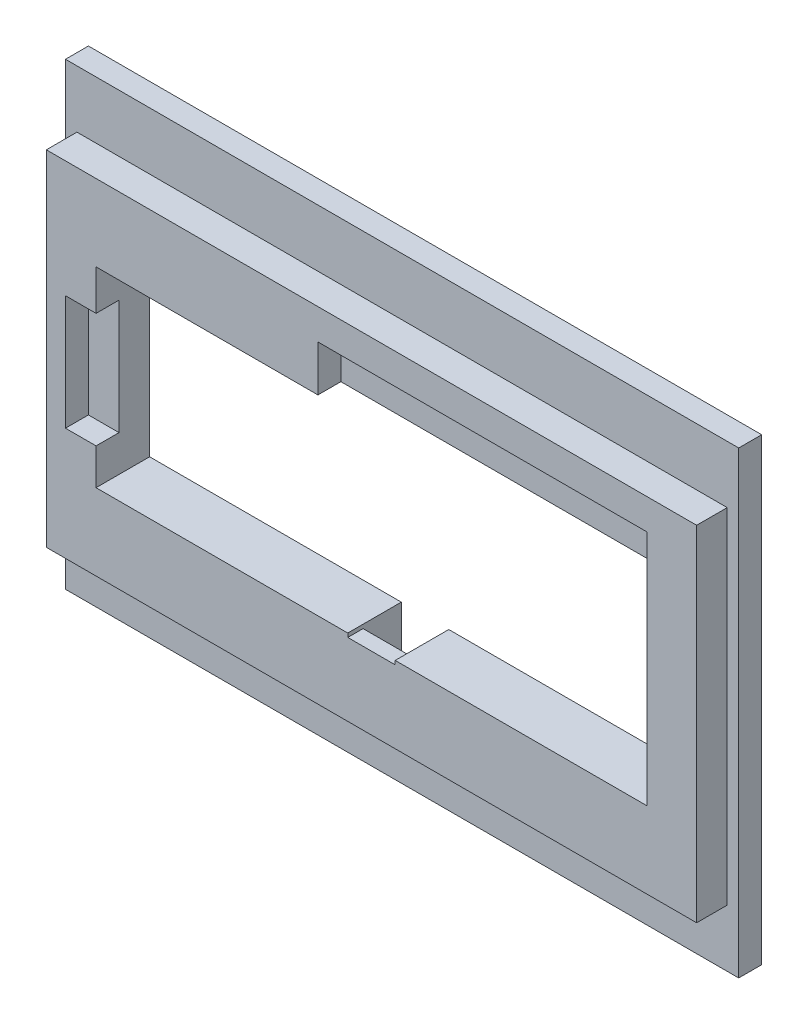
ISO-10303-21;
HEADER;
FILE_DESCRIPTION(('STEP AP214'),'2;1');
FILE_NAME('part.step','',(''),(''),'','','');
FILE_SCHEMA(('AUTOMOTIVE_DESIGN { 1 0 10303 214 1 1 1 1 }'));
ENDSEC;
DATA;
#1=APPLICATION_CONTEXT('core data for automotive mechanical design processes');
#2=APPLICATION_PROTOCOL_DEFINITION('international standard','automotive_design',2000,#1);
#3=PRODUCT_CONTEXT('',#1,'mechanical');
#4=PRODUCT('Part','Part','',(#3));
#5=PRODUCT_RELATED_PRODUCT_CATEGORY('part','',(#4));
#6=PRODUCT_DEFINITION_FORMATION('','',#4);
#7=PRODUCT_DEFINITION_CONTEXT('part definition',#1,'design');
#8=PRODUCT_DEFINITION('design','',#6,#7);
#9=PRODUCT_DEFINITION_SHAPE('','',#8);
#10=(LENGTH_UNIT() NAMED_UNIT(*) SI_UNIT(.MILLI.,.METRE.));
#11=(NAMED_UNIT(*) PLANE_ANGLE_UNIT() SI_UNIT($,.RADIAN.));
#12=(NAMED_UNIT(*) SI_UNIT($,.STERADIAN.) SOLID_ANGLE_UNIT());
#13=UNCERTAINTY_MEASURE_WITH_UNIT(LENGTH_MEASURE(1.E-05),#10,'distance_accuracy_value','');
#14=(GEOMETRIC_REPRESENTATION_CONTEXT(3) GLOBAL_UNCERTAINTY_ASSIGNED_CONTEXT((#13)) GLOBAL_UNIT_ASSIGNED_CONTEXT((#10,
#11,#12)) REPRESENTATION_CONTEXT('',''));
#15=CARTESIAN_POINT('',(0.,0.,0.));
#16=DIRECTION('',(0.,0.,1.));
#17=DIRECTION('',(1.,0.,0.));
#18=AXIS2_PLACEMENT_3D('',#15,#16,#17);
#19=CARTESIAN_POINT('',(-36.,-12.5,4.));
#20=DIRECTION('',(0.,1.,0.));
#21=DIRECTION('',(-1.,0.,0.));
#22=AXIS2_PLACEMENT_3D('',#19,#20,#21);
#23=PLANE('',#22);
#24=DIRECTION('',(1.,0.,0.));
#25=VECTOR('',#24,1.);
#26=CARTESIAN_POINT('',(-36.,-12.5,4.));
#27=LINE('',#26,#25);
#28=CARTESIAN_POINT('',(-36.,-12.5,4.));
#29=VERTEX_POINT('',#28);
#30=CARTESIAN_POINT('',(-3.1,-12.5,4.));
#31=VERTEX_POINT('',#30);
#32=EDGE_CURVE('E330',#29,#31,#27,.T.);
#33=ORIENTED_EDGE('',*,*,#32,.T.);
#34=DIRECTION('',(0.,0.,1.));
#35=VECTOR('',#34,1.);
#36=CARTESIAN_POINT('',(-3.1,-12.5,-3.));
#37=LINE('',#36,#35);
#38=CARTESIAN_POINT('',(-3.1,-12.5,-3.));
#39=VERTEX_POINT('',#38);
#40=EDGE_CURVE('E230',#39,#31,#37,.T.);
#41=ORIENTED_EDGE('',*,*,#40,.F.);
#42=DIRECTION('',(-1.,0.,0.));
#43=VECTOR('',#42,1.);
#44=CARTESIAN_POINT('',(36.,-12.5,-3.));
#45=LINE('',#44,#43);
#46=CARTESIAN_POINT('',(-36.,-12.5,-3.));
#47=VERTEX_POINT('',#46);
#48=EDGE_CURVE('E295',#39,#47,#45,.T.);
#49=ORIENTED_EDGE('',*,*,#48,.T.);
#50=DIRECTION('',(0.,0.,-1.));
#51=VECTOR('',#50,1.);
#52=CARTESIAN_POINT('',(-36.,-12.5,4.));
#53=LINE('',#52,#51);
#54=EDGE_CURVE('E341',#29,#47,#53,.T.);
#55=ORIENTED_EDGE('',*,*,#54,.F.);
#56=EDGE_LOOP('',(#33,#41,#49,#55));
#57=FACE_BOUND('',#56,.T.);
#58=ADVANCED_FACE('F36',(#57),#23,.T.);
#59=CARTESIAN_POINT('',(0.,0.,4.));
#60=DIRECTION('',(0.,0.,-1.));
#61=DIRECTION('',(-1.,0.,0.));
#62=AXIS2_PLACEMENT_3D('',#59,#60,#61);
#63=PLANE('',#62);
#64=DIRECTION('',(0.,1.,0.));
#65=VECTOR('',#64,1.);
#66=CARTESIAN_POINT('',(42.5,-22.5,4.));
#67=LINE('',#66,#65);
#68=CARTESIAN_POINT('',(42.5,-22.5,4.));
#69=VERTEX_POINT('',#68);
#70=CARTESIAN_POINT('',(42.5,22.5,4.));
#71=VERTEX_POINT('',#70);
#72=EDGE_CURVE('E351',#69,#71,#67,.T.);
#73=ORIENTED_EDGE('',*,*,#72,.T.);
#74=DIRECTION('',(-1.,0.,0.));
#75=VECTOR('',#74,1.);
#76=CARTESIAN_POINT('',(-42.5,22.5,4.));
#77=LINE('',#76,#75);
#78=CARTESIAN_POINT('',(-42.5,22.5,4.));
#79=VERTEX_POINT('',#78);
#80=EDGE_CURVE('E354',#71,#79,#77,.T.);
#81=ORIENTED_EDGE('',*,*,#80,.T.);
#82=DIRECTION('',(0.,-1.,0.));
#83=VECTOR('',#82,1.);
#84=CARTESIAN_POINT('',(-42.5,-22.5,4.));
#85=LINE('',#84,#83);
#86=CARTESIAN_POINT('',(-42.5,-22.5,4.));
#87=VERTEX_POINT('',#86);
#88=EDGE_CURVE('E357',#79,#87,#85,.T.);
#89=ORIENTED_EDGE('',*,*,#88,.T.);
#90=DIRECTION('',(1.,0.,0.));
#91=VECTOR('',#90,1.);
#92=CARTESIAN_POINT('',(-42.5,-22.5,4.));
#93=LINE('',#92,#91);
#94=EDGE_CURVE('E359',#87,#69,#93,.T.);
#95=ORIENTED_EDGE('',*,*,#94,.T.);
#96=EDGE_LOOP('',(#73,#81,#89,#95));
#97=FACE_BOUND('',#96,.T.);
#98=DIRECTION('',(-1.,0.,0.));
#99=VECTOR('',#98,1.);
#100=CARTESIAN_POINT('',(0.,-13.,4.));
#101=LINE('',#100,#99);
#102=CARTESIAN_POINT('',(3.1,-13.,4.));
#103=VERTEX_POINT('',#102);
#104=CARTESIAN_POINT('',(-3.1,-13.,4.));
#105=VERTEX_POINT('',#104);
#106=EDGE_CURVE('E207',#103,#105,#101,.T.);
#107=ORIENTED_EDGE('',*,*,#106,.T.);
#108=DIRECTION('',(0.,1.,0.));
#109=VECTOR('',#108,1.);
#110=CARTESIAN_POINT('',(-3.1,0.,4.));
#111=LINE('',#110,#109);
#112=EDGE_CURVE('E400',#105,#31,#111,.T.);
#113=ORIENTED_EDGE('',*,*,#112,.T.);
#114=ORIENTED_EDGE('',*,*,#32,.F.);
#115=DIRECTION('',(0.,-1.,0.));
#116=VECTOR('',#115,1.);
#117=CARTESIAN_POINT('',(-36.,-12.5,4.));
#118=LINE('',#117,#116);
#119=CARTESIAN_POINT('',(-36.,-7.76451613531069,4.));
#120=VERTEX_POINT('',#119);
#121=EDGE_CURVE('E337',#120,#29,#118,.T.);
#122=ORIENTED_EDGE('',*,*,#121,.F.);
#123=DIRECTION('',(1.,0.,0.));
#124=VECTOR('',#123,1.);
#125=CARTESIAN_POINT('',(-36.,-7.76451613531069,4.));
#126=LINE('',#125,#124);
#127=CARTESIAN_POINT('',(-40.,-7.76451613531069,4.));
#128=VERTEX_POINT('',#127);
#129=EDGE_CURVE('E263',#128,#120,#126,.T.);
#130=ORIENTED_EDGE('',*,*,#129,.F.);
#131=DIRECTION('',(0.,-1.,0.));
#132=VECTOR('',#131,1.);
#133=CARTESIAN_POINT('',(-40.,7.23548386468931,4.));
#134=LINE('',#133,#132);
#135=CARTESIAN_POINT('',(-40.,7.23548386468931,4.));
#136=VERTEX_POINT('',#135);
#137=EDGE_CURVE('E274',#136,#128,#134,.T.);
#138=ORIENTED_EDGE('',*,*,#137,.F.);
#139=DIRECTION('',(-1.,0.,0.));
#140=VECTOR('',#139,1.);
#141=CARTESIAN_POINT('',(-36.,7.23548386468931,4.));
#142=LINE('',#141,#140);
#143=CARTESIAN_POINT('',(-36.,7.23548386468931,4.));
#144=VERTEX_POINT('',#143);
#145=EDGE_CURVE('E254',#144,#136,#142,.T.);
#146=ORIENTED_EDGE('',*,*,#145,.F.);
#147=CARTESIAN_POINT('',(-36.,12.5,4.));
#148=VERTEX_POINT('',#147);
#149=EDGE_CURVE('E338',#148,#144,#118,.T.);
#150=ORIENTED_EDGE('',*,*,#149,.F.);
#151=DIRECTION('',(-1.,0.,0.));
#152=VECTOR('',#151,1.);
#153=CARTESIAN_POINT('',(-36.,12.5,4.));
#154=LINE('',#153,#152);
#155=CARTESIAN_POINT('',(-6.99999999999998,12.5,4.));
#156=VERTEX_POINT('',#155);
#157=EDGE_CURVE('E335',#156,#148,#154,.T.);
#158=ORIENTED_EDGE('',*,*,#157,.F.);
#159=DIRECTION('',(0.,-1.,0.));
#160=VECTOR('',#159,1.);
#161=CARTESIAN_POINT('',(-6.99999999999998,12.5,4.));
#162=LINE('',#161,#160);
#163=CARTESIAN_POINT('',(-6.99999999999998,18.5,4.));
#164=VERTEX_POINT('',#163);
#165=EDGE_CURVE('E225',#164,#156,#162,.T.);
#166=ORIENTED_EDGE('',*,*,#165,.F.);
#167=DIRECTION('',(-1.,0.,0.));
#168=VECTOR('',#167,1.);
#169=CARTESIAN_POINT('',(36.,18.5,4.));
#170=LINE('',#169,#168);
#171=CARTESIAN_POINT('',(36.,18.5,4.));
#172=VERTEX_POINT('',#171);
#173=EDGE_CURVE('E222',#172,#164,#170,.T.);
#174=ORIENTED_EDGE('',*,*,#173,.F.);
#175=DIRECTION('',(0.,1.,0.));
#176=VECTOR('',#175,1.);
#177=CARTESIAN_POINT('',(36.,-12.5,4.));
#178=LINE('',#177,#176);
#179=CARTESIAN_POINT('',(36.,-12.5,4.));
#180=VERTEX_POINT('',#179);
#181=EDGE_CURVE('E333',#180,#172,#178,.T.);
#182=ORIENTED_EDGE('',*,*,#181,.F.);
#183=CARTESIAN_POINT('',(3.1,-12.5,4.));
#184=VERTEX_POINT('',#183);
#185=EDGE_CURVE('E329',#184,#180,#27,.T.);
#186=ORIENTED_EDGE('',*,*,#185,.F.);
#187=DIRECTION('',(0.,-1.,0.));
#188=VECTOR('',#187,1.);
#189=CARTESIAN_POINT('',(3.09999999999999,0.,4.));
#190=LINE('',#189,#188);
#191=EDGE_CURVE('E402',#184,#103,#190,.T.);
#192=ORIENTED_EDGE('',*,*,#191,.T.);
#193=EDGE_LOOP('',(#107,#113,#114,#122,#130,#138,#146,#150,#158,#166,#174,#182,#186,#192));
#194=FACE_BOUND('',#193,.T.);
#195=ADVANCED_FACE('F394',(#97,#194),#63,.F.);
#196=CARTESIAN_POINT('',(42.5,-22.5,4.));
#197=DIRECTION('',(-1.,0.,0.));
#198=DIRECTION('',(0.,0.,1.));
#199=AXIS2_PLACEMENT_3D('',#196,#197,#198);
#200=PLANE('',#199);
#201=DIRECTION('',(0.,1.,0.));
#202=VECTOR('',#201,1.);
#203=CARTESIAN_POINT('',(42.5,-22.5,0.));
#204=LINE('',#203,#202);
#205=CARTESIAN_POINT('',(42.5,-22.5,0.));
#206=VERTEX_POINT('',#205);
#207=CARTESIAN_POINT('',(42.5,22.5,0.));
#208=VERTEX_POINT('',#207);
#209=EDGE_CURVE('E350',#206,#208,#204,.T.);
#210=ORIENTED_EDGE('',*,*,#209,.T.);
#211=DIRECTION('',(0.,0.,-1.));
#212=VECTOR('',#211,1.);
#213=CARTESIAN_POINT('',(42.5,22.5,4.));
#214=LINE('',#213,#212);
#215=EDGE_CURVE('E11',#71,#208,#214,.T.);
#216=ORIENTED_EDGE('',*,*,#215,.F.);
#217=ORIENTED_EDGE('',*,*,#72,.F.);
#218=DIRECTION('',(0.,0.,-1.));
#219=VECTOR('',#218,1.);
#220=CARTESIAN_POINT('',(42.5,-22.5,4.));
#221=LINE('',#220,#219);
#222=EDGE_CURVE('E361',#69,#206,#221,.T.);
#223=ORIENTED_EDGE('',*,*,#222,.T.);
#224=EDGE_LOOP('',(#210,#216,#217,#223));
#225=FACE_BOUND('',#224,.T.);
#226=ADVANCED_FACE('F38',(#225),#200,.F.);
#227=CARTESIAN_POINT('',(-42.5,22.5,4.));
#228=DIRECTION('',(0.,-1.,0.));
#229=DIRECTION('',(0.,0.,-1.));
#230=AXIS2_PLACEMENT_3D('',#227,#228,#229);
#231=PLANE('',#230);
#232=DIRECTION('',(-1.,0.,0.));
#233=VECTOR('',#232,1.);
#234=CARTESIAN_POINT('',(-42.5,22.5,0.));
#235=LINE('',#234,#233);
#236=CARTESIAN_POINT('',(-42.5,22.5,0.));
#237=VERTEX_POINT('',#236);
#238=EDGE_CURVE('E364',#208,#237,#235,.T.);
#239=ORIENTED_EDGE('',*,*,#238,.T.);
#240=DIRECTION('',(0.,0.,-1.));
#241=VECTOR('',#240,1.);
#242=CARTESIAN_POINT('',(-42.5,22.5,4.));
#243=LINE('',#242,#241);
#244=EDGE_CURVE('E44',#79,#237,#243,.T.);
#245=ORIENTED_EDGE('',*,*,#244,.F.);
#246=ORIENTED_EDGE('',*,*,#80,.F.);
#247=ORIENTED_EDGE('',*,*,#215,.T.);
#248=EDGE_LOOP('',(#239,#245,#246,#247));
#249=FACE_BOUND('',#248,.T.);
#250=ADVANCED_FACE('F383',(#249),#231,.F.);
#251=CARTESIAN_POINT('',(-42.5,-22.5,4.));
#252=DIRECTION('',(1.,0.,0.));
#253=DIRECTION('',(0.,0.,-1.));
#254=AXIS2_PLACEMENT_3D('',#251,#252,#253);
#255=PLANE('',#254);
#256=DIRECTION('',(0.,-1.,0.));
#257=VECTOR('',#256,1.);
#258=CARTESIAN_POINT('',(-42.5,-22.5,0.));
#259=LINE('',#258,#257);
#260=CARTESIAN_POINT('',(-42.5,-22.5,0.));
#261=VERTEX_POINT('',#260);
#262=EDGE_CURVE('E367',#237,#261,#259,.T.);
#263=ORIENTED_EDGE('',*,*,#262,.T.);
#264=DIRECTION('',(0.,0.,-1.));
#265=VECTOR('',#264,1.);
#266=CARTESIAN_POINT('',(-42.5,-22.5,4.));
#267=LINE('',#266,#265);
#268=EDGE_CURVE('E374',#87,#261,#267,.T.);
#269=ORIENTED_EDGE('',*,*,#268,.F.);
#270=ORIENTED_EDGE('',*,*,#88,.F.);
#271=ORIENTED_EDGE('',*,*,#244,.T.);
#272=EDGE_LOOP('',(#263,#269,#270,#271));
#273=FACE_BOUND('',#272,.T.);
#274=ADVANCED_FACE('F380',(#273),#255,.F.);
#275=CARTESIAN_POINT('',(-42.5,-22.5,4.));
#276=DIRECTION('',(0.,1.,0.));
#277=DIRECTION('',(0.,0.,1.));
#278=AXIS2_PLACEMENT_3D('',#275,#276,#277);
#279=PLANE('',#278);
#280=DIRECTION('',(1.,0.,0.));
#281=VECTOR('',#280,1.);
#282=CARTESIAN_POINT('',(-42.5,-22.5,0.));
#283=LINE('',#282,#281);
#284=EDGE_CURVE('E355',#261,#206,#283,.T.);
#285=ORIENTED_EDGE('',*,*,#284,.T.);
#286=ORIENTED_EDGE('',*,*,#222,.F.);
#287=ORIENTED_EDGE('',*,*,#94,.F.);
#288=ORIENTED_EDGE('',*,*,#268,.T.);
#289=EDGE_LOOP('',(#285,#286,#287,#288));
#290=FACE_BOUND('',#289,.T.);
#291=ADVANCED_FACE('F389',(#290),#279,.F.);
#292=DIRECTION('',(0.,0.,-1.));
#293=VECTOR('',#292,1.);
#294=CARTESIAN_POINT('',(3.1,-12.5,-3.));
#295=LINE('',#294,#293);
#296=CARTESIAN_POINT('',(3.1,-12.5,-3.));
#297=VERTEX_POINT('',#296);
#298=EDGE_CURVE('E404',#184,#297,#295,.T.);
#299=ORIENTED_EDGE('',*,*,#298,.F.);
#300=ORIENTED_EDGE('',*,*,#185,.T.);
#301=DIRECTION('',(0.,0.,-1.));
#302=VECTOR('',#301,1.);
#303=CARTESIAN_POINT('',(36.,-12.5,4.));
#304=LINE('',#303,#302);
#305=CARTESIAN_POINT('',(36.,-12.5,-3.));
#306=VERTEX_POINT('',#305);
#307=EDGE_CURVE('E348',#180,#306,#304,.T.);
#308=ORIENTED_EDGE('',*,*,#307,.T.);
#309=EDGE_CURVE('E296',#306,#297,#45,.T.);
#310=ORIENTED_EDGE('',*,*,#309,.T.);
#311=EDGE_LOOP('',(#299,#300,#308,#310));
#312=FACE_BOUND('',#311,.T.);
#313=ADVANCED_FACE('F468',(#312),#23,.T.);
#314=CARTESIAN_POINT('',(36.,-12.5,4.));
#315=DIRECTION('',(-1.,0.,0.));
#316=DIRECTION('',(0.,0.,1.));
#317=AXIS2_PLACEMENT_3D('',#314,#315,#316);
#318=PLANE('',#317);
#319=ORIENTED_EDGE('',*,*,#181,.T.);
#320=DIRECTION('',(0.,0.,1.));
#321=VECTOR('',#320,1.);
#322=CARTESIAN_POINT('',(36.,18.5,1.));
#323=LINE('',#322,#321);
#324=CARTESIAN_POINT('',(36.,18.5,1.));
#325=VERTEX_POINT('',#324);
#326=EDGE_CURVE('E248',#325,#172,#323,.T.);
#327=ORIENTED_EDGE('',*,*,#326,.F.);
#328=DIRECTION('',(0.,1.,0.));
#329=VECTOR('',#328,1.);
#330=CARTESIAN_POINT('',(36.,12.5,1.));
#331=LINE('',#330,#329);
#332=CARTESIAN_POINT('',(36.,12.5,1.));
#333=VERTEX_POINT('',#332);
#334=EDGE_CURVE('E238',#333,#325,#331,.T.);
#335=ORIENTED_EDGE('',*,*,#334,.F.);
#336=DIRECTION('',(0.,0.,-1.));
#337=VECTOR('',#336,1.);
#338=CARTESIAN_POINT('',(36.,12.5,4.));
#339=LINE('',#338,#337);
#340=CARTESIAN_POINT('',(36.,12.5,-3.));
#341=VERTEX_POINT('',#340);
#342=EDGE_CURVE('E346',#333,#341,#339,.T.);
#343=ORIENTED_EDGE('',*,*,#342,.T.);
#344=DIRECTION('',(0.,-1.,0.));
#345=VECTOR('',#344,1.);
#346=CARTESIAN_POINT('',(36.,-12.5,-3.));
#347=LINE('',#346,#345);
#348=EDGE_CURVE('E292',#341,#306,#347,.T.);
#349=ORIENTED_EDGE('',*,*,#348,.T.);
#350=ORIENTED_EDGE('',*,*,#307,.F.);
#351=EDGE_LOOP('',(#319,#327,#335,#343,#349,#350));
#352=FACE_BOUND('',#351,.T.);
#353=ADVANCED_FACE('F465',(#352),#318,.T.);
#354=CARTESIAN_POINT('',(-36.,12.5,4.));
#355=DIRECTION('',(0.,-1.,0.));
#356=DIRECTION('',(1.,0.,0.));
#357=AXIS2_PLACEMENT_3D('',#354,#355,#356);
#358=PLANE('',#357);
#359=DIRECTION('',(0.,0.,1.));
#360=VECTOR('',#359,1.);
#361=CARTESIAN_POINT('',(-6.99999999999998,12.5,1.));
#362=LINE('',#361,#360);
#363=CARTESIAN_POINT('',(-6.99999999999998,12.5,1.));
#364=VERTEX_POINT('',#363);
#365=EDGE_CURVE('E251',#364,#156,#362,.T.);
#366=ORIENTED_EDGE('',*,*,#365,.T.);
#367=ORIENTED_EDGE('',*,*,#157,.T.);
#368=DIRECTION('',(0.,0.,-1.));
#369=VECTOR('',#368,1.);
#370=CARTESIAN_POINT('',(-36.,12.5,4.));
#371=LINE('',#370,#369);
#372=CARTESIAN_POINT('',(-36.,12.5,-3.));
#373=VERTEX_POINT('',#372);
#374=EDGE_CURVE('E344',#148,#373,#371,.T.);
#375=ORIENTED_EDGE('',*,*,#374,.T.);
#376=DIRECTION('',(1.,0.,0.));
#377=VECTOR('',#376,1.);
#378=CARTESIAN_POINT('',(36.,12.5,-3.));
#379=LINE('',#378,#377);
#380=EDGE_CURVE('E289',#373,#341,#379,.T.);
#381=ORIENTED_EDGE('',*,*,#380,.T.);
#382=ORIENTED_EDGE('',*,*,#342,.F.);
#383=DIRECTION('',(1.,0.,0.));
#384=VECTOR('',#383,1.);
#385=CARTESIAN_POINT('',(36.,12.5,1.));
#386=LINE('',#385,#384);
#387=EDGE_CURVE('E246',#364,#333,#386,.T.);
#388=ORIENTED_EDGE('',*,*,#387,.F.);
#389=EDGE_LOOP('',(#366,#367,#375,#381,#382,#388));
#390=FACE_BOUND('',#389,.T.);
#391=ADVANCED_FACE('F452',(#390),#358,.T.);
#392=CARTESIAN_POINT('',(-36.,-12.5,4.));
#393=DIRECTION('',(1.,0.,0.));
#394=DIRECTION('',(0.,0.,-1.));
#395=AXIS2_PLACEMENT_3D('',#392,#393,#394);
#396=PLANE('',#395);
#397=DIRECTION('',(0.,0.,1.));
#398=VECTOR('',#397,1.);
#399=CARTESIAN_POINT('',(-36.,-7.76451613531069,1.));
#400=LINE('',#399,#398);
#401=CARTESIAN_POINT('',(-36.,-7.76451613531069,1.));
#402=VERTEX_POINT('',#401);
#403=EDGE_CURVE('E278',#402,#120,#400,.T.);
#404=ORIENTED_EDGE('',*,*,#403,.T.);
#405=ORIENTED_EDGE('',*,*,#121,.T.);
#406=ORIENTED_EDGE('',*,*,#54,.T.);
#407=DIRECTION('',(0.,1.,0.));
#408=VECTOR('',#407,1.);
#409=CARTESIAN_POINT('',(-36.,-12.5,-3.));
#410=LINE('',#409,#408);
#411=EDGE_CURVE('E281',#47,#373,#410,.T.);
#412=ORIENTED_EDGE('',*,*,#411,.T.);
#413=ORIENTED_EDGE('',*,*,#374,.F.);
#414=ORIENTED_EDGE('',*,*,#149,.T.);
#415=DIRECTION('',(0.,0.,1.));
#416=VECTOR('',#415,1.);
#417=CARTESIAN_POINT('',(-36.,7.23548386468931,1.));
#418=LINE('',#417,#416);
#419=CARTESIAN_POINT('',(-36.,7.23548386468931,1.));
#420=VERTEX_POINT('',#419);
#421=EDGE_CURVE('E271',#420,#144,#418,.T.);
#422=ORIENTED_EDGE('',*,*,#421,.F.);
#423=DIRECTION('',(0.,1.,0.));
#424=VECTOR('',#423,1.);
#425=CARTESIAN_POINT('',(-36.,7.23548386468931,1.));
#426=LINE('',#425,#424);
#427=EDGE_CURVE('E259',#402,#420,#426,.T.);
#428=ORIENTED_EDGE('',*,*,#427,.F.);
#429=EDGE_LOOP('',(#404,#405,#406,#412,#413,#414,#422,#428));
#430=FACE_BOUND('',#429,.T.);
#431=ADVANCED_FACE('F429',(#430),#396,.T.);
#432=CARTESIAN_POINT('',(0.,0.,0.));
#433=DIRECTION('',(0.,0.,1.));
#434=DIRECTION('',(1.,0.,0.));
#435=AXIS2_PLACEMENT_3D('',#432,#433,#434);
#436=PLANE('',#435);
#437=DIRECTION('',(0.,1.,0.));
#438=VECTOR('',#437,1.);
#439=CARTESIAN_POINT('',(-44.,-30.,0.));
#440=LINE('',#439,#438);
#441=CARTESIAN_POINT('',(-44.,-30.,0.));
#442=VERTEX_POINT('',#441);
#443=CARTESIAN_POINT('',(-44.,30.,0.));
#444=VERTEX_POINT('',#443);
#445=EDGE_CURVE('E299',#442,#444,#440,.T.);
#446=ORIENTED_EDGE('',*,*,#445,.F.);
#447=DIRECTION('',(-1.,0.,0.));
#448=VECTOR('',#447,1.);
#449=CARTESIAN_POINT('',(44.,-30.,0.));
#450=LINE('',#449,#448);
#451=CARTESIAN_POINT('',(44.,-30.,0.));
#452=VERTEX_POINT('',#451);
#453=EDGE_CURVE('E304',#452,#442,#450,.T.);
#454=ORIENTED_EDGE('',*,*,#453,.F.);
#455=DIRECTION('',(0.,-1.,0.));
#456=VECTOR('',#455,1.);
#457=CARTESIAN_POINT('',(44.,-30.,0.));
#458=LINE('',#457,#456);
#459=CARTESIAN_POINT('',(44.,30.,0.));
#460=VERTEX_POINT('',#459);
#461=EDGE_CURVE('E315',#460,#452,#458,.T.);
#462=ORIENTED_EDGE('',*,*,#461,.F.);
#463=DIRECTION('',(1.,0.,0.));
#464=VECTOR('',#463,1.);
#465=CARTESIAN_POINT('',(44.,30.,0.));
#466=LINE('',#465,#464);
#467=EDGE_CURVE('E313',#444,#460,#466,.T.);
#468=ORIENTED_EDGE('',*,*,#467,.F.);
#469=EDGE_LOOP('',(#446,#454,#462,#468));
#470=FACE_BOUND('',#469,.T.);
#471=ORIENTED_EDGE('',*,*,#209,.F.);
#472=ORIENTED_EDGE('',*,*,#284,.F.);
#473=ORIENTED_EDGE('',*,*,#262,.F.);
#474=ORIENTED_EDGE('',*,*,#238,.F.);
#475=EDGE_LOOP('',(#471,#472,#473,#474));
#476=FACE_BOUND('',#475,.T.);
#477=ADVANCED_FACE('F386',(#470,#476),#436,.T.);
#478=CARTESIAN_POINT('',(0.,0.,-3.));
#479=DIRECTION('',(0.,0.,1.));
#480=DIRECTION('',(1.,0.,0.));
#481=AXIS2_PLACEMENT_3D('',#478,#479,#480);
#482=PLANE('',#481);
#483=DIRECTION('',(0.,1.,0.));
#484=VECTOR('',#483,1.);
#485=CARTESIAN_POINT('',(-44.,-30.,-3.));
#486=LINE('',#485,#484);
#487=CARTESIAN_POINT('',(-44.,-30.,-3.));
#488=VERTEX_POINT('',#487);
#489=CARTESIAN_POINT('',(-44.,30.,-3.));
#490=VERTEX_POINT('',#489);
#491=EDGE_CURVE('E300',#488,#490,#486,.T.);
#492=ORIENTED_EDGE('',*,*,#491,.T.);
#493=DIRECTION('',(1.,0.,0.));
#494=VECTOR('',#493,1.);
#495=CARTESIAN_POINT('',(44.,30.,-3.));
#496=LINE('',#495,#494);
#497=CARTESIAN_POINT('',(44.,30.,-3.));
#498=VERTEX_POINT('',#497);
#499=EDGE_CURVE('E303',#490,#498,#496,.T.);
#500=ORIENTED_EDGE('',*,*,#499,.T.);
#501=DIRECTION('',(0.,-1.,0.));
#502=VECTOR('',#501,1.);
#503=CARTESIAN_POINT('',(44.,-30.,-3.));
#504=LINE('',#503,#502);
#505=CARTESIAN_POINT('',(44.,-30.,-3.));
#506=VERTEX_POINT('',#505);
#507=EDGE_CURVE('E306',#498,#506,#504,.T.);
#508=ORIENTED_EDGE('',*,*,#507,.T.);
#509=DIRECTION('',(-1.,0.,0.));
#510=VECTOR('',#509,1.);
#511=CARTESIAN_POINT('',(44.,-30.,-3.));
#512=LINE('',#511,#510);
#513=EDGE_CURVE('E308',#506,#488,#512,.T.);
#514=ORIENTED_EDGE('',*,*,#513,.T.);
#515=EDGE_LOOP('',(#492,#500,#508,#514));
#516=FACE_BOUND('',#515,.T.);
#517=DIRECTION('',(-1.,0.,0.));
#518=VECTOR('',#517,1.);
#519=CARTESIAN_POINT('',(-3.1,-21.5,-3.));
#520=LINE('',#519,#518);
#521=CARTESIAN_POINT('',(3.1,-21.5,-3.));
#522=VERTEX_POINT('',#521);
#523=CARTESIAN_POINT('',(-3.1,-21.5,-3.));
#524=VERTEX_POINT('',#523);
#525=EDGE_CURVE('E409',#522,#524,#520,.T.);
#526=ORIENTED_EDGE('',*,*,#525,.F.);
#527=DIRECTION('',(0.,1.,0.));
#528=VECTOR('',#527,1.);
#529=CARTESIAN_POINT('',(3.1,-21.5,-3.));
#530=LINE('',#529,#528);
#531=EDGE_CURVE('E234',#522,#297,#530,.T.);
#532=ORIENTED_EDGE('',*,*,#531,.T.);
#533=ORIENTED_EDGE('',*,*,#309,.F.);
#534=ORIENTED_EDGE('',*,*,#348,.F.);
#535=ORIENTED_EDGE('',*,*,#380,.F.);
#536=ORIENTED_EDGE('',*,*,#411,.F.);
#537=ORIENTED_EDGE('',*,*,#48,.F.);
#538=DIRECTION('',(0.,1.,0.));
#539=VECTOR('',#538,1.);
#540=CARTESIAN_POINT('',(-3.1,-21.5,-3.));
#541=LINE('',#540,#539);
#542=EDGE_CURVE('E227',#524,#39,#541,.T.);
#543=ORIENTED_EDGE('',*,*,#542,.F.);
#544=EDGE_LOOP('',(#526,#532,#533,#534,#535,#536,#537,#543));
#545=FACE_BOUND('',#544,.T.);
#546=ADVANCED_FACE('F424',(#516,#545),#482,.F.);
#547=CARTESIAN_POINT('',(-44.,-30.,-3.));
#548=DIRECTION('',(1.,0.,0.));
#549=DIRECTION('',(0.,0.,-1.));
#550=AXIS2_PLACEMENT_3D('',#547,#548,#549);
#551=PLANE('',#550);
#552=ORIENTED_EDGE('',*,*,#445,.T.);
#553=DIRECTION('',(0.,0.,1.));
#554=VECTOR('',#553,1.);
#555=CARTESIAN_POINT('',(-44.,30.,-3.));
#556=LINE('',#555,#554);
#557=EDGE_CURVE('E326',#490,#444,#556,.T.);
#558=ORIENTED_EDGE('',*,*,#557,.F.);
#559=ORIENTED_EDGE('',*,*,#491,.F.);
#560=DIRECTION('',(0.,0.,1.));
#561=VECTOR('',#560,1.);
#562=CARTESIAN_POINT('',(-44.,-30.,-3.));
#563=LINE('',#562,#561);
#564=EDGE_CURVE('E310',#488,#442,#563,.T.);
#565=ORIENTED_EDGE('',*,*,#564,.T.);
#566=EDGE_LOOP('',(#552,#558,#559,#565));
#567=FACE_BOUND('',#566,.T.);
#568=ADVANCED_FACE('F565',(#567),#551,.F.);
#569=CARTESIAN_POINT('',(44.,30.,-3.));
#570=DIRECTION('',(0.,-1.,0.));
#571=DIRECTION('',(0.,0.,-1.));
#572=AXIS2_PLACEMENT_3D('',#569,#570,#571);
#573=PLANE('',#572);
#574=ORIENTED_EDGE('',*,*,#467,.T.);
#575=DIRECTION('',(0.,0.,1.));
#576=VECTOR('',#575,1.);
#577=CARTESIAN_POINT('',(44.,30.,-3.));
#578=LINE('',#577,#576);
#579=EDGE_CURVE('E323',#498,#460,#578,.T.);
#580=ORIENTED_EDGE('',*,*,#579,.F.);
#581=ORIENTED_EDGE('',*,*,#499,.F.);
#582=ORIENTED_EDGE('',*,*,#557,.T.);
#583=EDGE_LOOP('',(#574,#580,#581,#582));
#584=FACE_BOUND('',#583,.T.);
#585=ADVANCED_FACE('F669',(#584),#573,.F.);
#586=CARTESIAN_POINT('',(44.,-30.,-3.));
#587=DIRECTION('',(-1.,0.,0.));
#588=DIRECTION('',(0.,0.,1.));
#589=AXIS2_PLACEMENT_3D('',#586,#587,#588);
#590=PLANE('',#589);
#591=ORIENTED_EDGE('',*,*,#461,.T.);
#592=DIRECTION('',(0.,0.,1.));
#593=VECTOR('',#592,1.);
#594=CARTESIAN_POINT('',(44.,-30.,-3.));
#595=LINE('',#594,#593);
#596=EDGE_CURVE('E320',#506,#452,#595,.T.);
#597=ORIENTED_EDGE('',*,*,#596,.F.);
#598=ORIENTED_EDGE('',*,*,#507,.F.);
#599=ORIENTED_EDGE('',*,*,#579,.T.);
#600=EDGE_LOOP('',(#591,#597,#598,#599));
#601=FACE_BOUND('',#600,.T.);
#602=ADVANCED_FACE('F659',(#601),#590,.F.);
#603=CARTESIAN_POINT('',(44.,-30.,-3.));
#604=DIRECTION('',(0.,1.,0.));
#605=DIRECTION('',(0.,0.,1.));
#606=AXIS2_PLACEMENT_3D('',#603,#604,#605);
#607=PLANE('',#606);
#608=ORIENTED_EDGE('',*,*,#453,.T.);
#609=ORIENTED_EDGE('',*,*,#564,.F.);
#610=ORIENTED_EDGE('',*,*,#513,.F.);
#611=ORIENTED_EDGE('',*,*,#596,.T.);
#612=EDGE_LOOP('',(#608,#609,#610,#611));
#613=FACE_BOUND('',#612,.T.);
#614=ADVANCED_FACE('F644',(#613),#607,.F.);
#615=CARTESIAN_POINT('',(-36.,-7.76451613531069,1.));
#616=DIRECTION('',(0.,-1.,0.));
#617=DIRECTION('',(1.,0.,0.));
#618=AXIS2_PLACEMENT_3D('',#615,#616,#617);
#619=PLANE('',#618);
#620=ORIENTED_EDGE('',*,*,#129,.T.);
#621=ORIENTED_EDGE('',*,*,#403,.F.);
#622=DIRECTION('',(1.,0.,0.));
#623=VECTOR('',#622,1.);
#624=CARTESIAN_POINT('',(-36.,-7.76451613531069,1.));
#625=LINE('',#624,#623);
#626=CARTESIAN_POINT('',(-40.,-7.76451613531069,1.));
#627=VERTEX_POINT('',#626);
#628=EDGE_CURVE('E269',#627,#402,#625,.T.);
#629=ORIENTED_EDGE('',*,*,#628,.F.);
#630=DIRECTION('',(0.,0.,1.));
#631=VECTOR('',#630,1.);
#632=CARTESIAN_POINT('',(-40.,-7.76451613531069,1.));
#633=LINE('',#632,#631);
#634=EDGE_CURVE('E282',#627,#128,#633,.T.);
#635=ORIENTED_EDGE('',*,*,#634,.T.);
#636=EDGE_LOOP('',(#620,#621,#629,#635));
#637=FACE_BOUND('',#636,.T.);
#638=ADVANCED_FACE('F437',(#637),#619,.F.);
#639=CARTESIAN_POINT('',(-40.,7.23548386468931,1.));
#640=DIRECTION('',(-1.,0.,0.));
#641=DIRECTION('',(0.,0.,1.));
#642=AXIS2_PLACEMENT_3D('',#639,#640,#641);
#643=PLANE('',#642);
#644=ORIENTED_EDGE('',*,*,#137,.T.);
#645=ORIENTED_EDGE('',*,*,#634,.F.);
#646=DIRECTION('',(0.,-1.,0.));
#647=VECTOR('',#646,1.);
#648=CARTESIAN_POINT('',(-40.,7.23548386468931,1.));
#649=LINE('',#648,#647);
#650=CARTESIAN_POINT('',(-40.,7.23548386468931,1.));
#651=VERTEX_POINT('',#650);
#652=EDGE_CURVE('E266',#651,#627,#649,.T.);
#653=ORIENTED_EDGE('',*,*,#652,.F.);
#654=DIRECTION('',(0.,0.,1.));
#655=VECTOR('',#654,1.);
#656=CARTESIAN_POINT('',(-40.,7.23548386468931,1.));
#657=LINE('',#656,#655);
#658=EDGE_CURVE('E284',#651,#136,#657,.T.);
#659=ORIENTED_EDGE('',*,*,#658,.T.);
#660=EDGE_LOOP('',(#644,#645,#653,#659));
#661=FACE_BOUND('',#660,.T.);
#662=ADVANCED_FACE('F445',(#661),#643,.F.);
#663=CARTESIAN_POINT('',(-36.,7.23548386468931,1.));
#664=DIRECTION('',(0.,1.,0.));
#665=DIRECTION('',(-1.,0.,0.));
#666=AXIS2_PLACEMENT_3D('',#663,#664,#665);
#667=PLANE('',#666);
#668=ORIENTED_EDGE('',*,*,#145,.T.);
#669=ORIENTED_EDGE('',*,*,#658,.F.);
#670=DIRECTION('',(-1.,0.,0.));
#671=VECTOR('',#670,1.);
#672=CARTESIAN_POINT('',(-36.,7.23548386468931,1.));
#673=LINE('',#672,#671);
#674=EDGE_CURVE('E262',#420,#651,#673,.T.);
#675=ORIENTED_EDGE('',*,*,#674,.F.);
#676=ORIENTED_EDGE('',*,*,#421,.T.);
#677=EDGE_LOOP('',(#668,#669,#675,#676));
#678=FACE_BOUND('',#677,.T.);
#679=ADVANCED_FACE('F447',(#678),#667,.F.);
#680=CARTESIAN_POINT('',(0.,0.,1.));
#681=DIRECTION('',(0.,0.,-1.));
#682=DIRECTION('',(-1.,0.,0.));
#683=AXIS2_PLACEMENT_3D('',#680,#681,#682);
#684=PLANE('',#683);
#685=ORIENTED_EDGE('',*,*,#427,.T.);
#686=ORIENTED_EDGE('',*,*,#674,.T.);
#687=ORIENTED_EDGE('',*,*,#652,.T.);
#688=ORIENTED_EDGE('',*,*,#628,.T.);
#689=EDGE_LOOP('',(#685,#686,#687,#688));
#690=FACE_BOUND('',#689,.T.);
#691=ADVANCED_FACE('F442',(#690),#684,.F.);
#692=CARTESIAN_POINT('',(-6.99999999999998,12.5,1.));
#693=DIRECTION('',(-1.,0.,0.));
#694=DIRECTION('',(0.,-1.,0.));
#695=AXIS2_PLACEMENT_3D('',#692,#693,#694);
#696=PLANE('',#695);
#697=ORIENTED_EDGE('',*,*,#165,.T.);
#698=ORIENTED_EDGE('',*,*,#365,.F.);
#699=DIRECTION('',(0.,-1.,0.));
#700=VECTOR('',#699,1.);
#701=CARTESIAN_POINT('',(-6.99999999999998,12.5,1.));
#702=LINE('',#701,#700);
#703=CARTESIAN_POINT('',(-6.99999999999998,18.5,1.));
#704=VERTEX_POINT('',#703);
#705=EDGE_CURVE('E244',#704,#364,#702,.T.);
#706=ORIENTED_EDGE('',*,*,#705,.F.);
#707=DIRECTION('',(0.,0.,1.));
#708=VECTOR('',#707,1.);
#709=CARTESIAN_POINT('',(-6.99999999999998,18.5,1.));
#710=LINE('',#709,#708);
#711=EDGE_CURVE('E255',#704,#164,#710,.T.);
#712=ORIENTED_EDGE('',*,*,#711,.T.);
#713=EDGE_LOOP('',(#697,#698,#706,#712));
#714=FACE_BOUND('',#713,.T.);
#715=ADVANCED_FACE('F458',(#714),#696,.F.);
#716=CARTESIAN_POINT('',(36.,18.5,1.));
#717=DIRECTION('',(0.,1.,0.));
#718=DIRECTION('',(-1.,0.,0.));
#719=AXIS2_PLACEMENT_3D('',#716,#717,#718);
#720=PLANE('',#719);
#721=ORIENTED_EDGE('',*,*,#173,.T.);
#722=ORIENTED_EDGE('',*,*,#711,.F.);
#723=DIRECTION('',(-1.,0.,0.));
#724=VECTOR('',#723,1.);
#725=CARTESIAN_POINT('',(36.,18.5,1.));
#726=LINE('',#725,#724);
#727=EDGE_CURVE('E241',#325,#704,#726,.T.);
#728=ORIENTED_EDGE('',*,*,#727,.F.);
#729=ORIENTED_EDGE('',*,*,#326,.T.);
#730=EDGE_LOOP('',(#721,#722,#728,#729));
#731=FACE_BOUND('',#730,.T.);
#732=ADVANCED_FACE('F461',(#731),#720,.F.);
#733=CARTESIAN_POINT('',(0.,0.,1.));
#734=DIRECTION('',(0.,0.,1.));
#735=DIRECTION('',(1.,0.,0.));
#736=AXIS2_PLACEMENT_3D('',#733,#734,#735);
#737=PLANE('',#736);
#738=ORIENTED_EDGE('',*,*,#334,.T.);
#739=ORIENTED_EDGE('',*,*,#727,.T.);
#740=ORIENTED_EDGE('',*,*,#705,.T.);
#741=ORIENTED_EDGE('',*,*,#387,.T.);
#742=EDGE_LOOP('',(#738,#739,#740,#741));
#743=FACE_BOUND('',#742,.T.);
#744=ADVANCED_FACE('F523',(#743),#737,.T.);
#745=CARTESIAN_POINT('',(3.1,-21.5,-3.));
#746=DIRECTION('',(1.,0.,0.));
#747=DIRECTION('',(0.,1.,0.));
#748=AXIS2_PLACEMENT_3D('',#745,#746,#747);
#749=PLANE('',#748);
#750=ORIENTED_EDGE('',*,*,#298,.T.);
#751=ORIENTED_EDGE('',*,*,#531,.F.);
#752=DIRECTION('',(0.,0.,-1.));
#753=VECTOR('',#752,1.);
#754=CARTESIAN_POINT('',(3.1,-21.5,-3.));
#755=LINE('',#754,#753);
#756=CARTESIAN_POINT('',(3.1,-21.5,2.));
#757=VERTEX_POINT('',#756);
#758=EDGE_CURVE('E59',#757,#522,#755,.T.);
#759=ORIENTED_EDGE('',*,*,#758,.F.);
#760=DIRECTION('',(0.,1.,0.));
#761=VECTOR('',#760,1.);
#762=CARTESIAN_POINT('',(3.1,-21.5,2.));
#763=LINE('',#762,#761);
#764=CARTESIAN_POINT('',(3.1,-13.,2.));
#765=VERTEX_POINT('',#764);
#766=EDGE_CURVE('E218',#757,#765,#763,.T.);
#767=ORIENTED_EDGE('',*,*,#766,.T.);
#768=DIRECTION('',(0.,0.,-1.));
#769=VECTOR('',#768,1.);
#770=CARTESIAN_POINT('',(3.1,-13.,12.));
#771=LINE('',#770,#769);
#772=EDGE_CURVE('E204',#103,#765,#771,.T.);
#773=ORIENTED_EDGE('',*,*,#772,.F.);
#774=ORIENTED_EDGE('',*,*,#191,.F.);
#775=EDGE_LOOP('',(#750,#751,#759,#767,#773,#774));
#776=FACE_BOUND('',#775,.T.);
#777=ADVANCED_FACE('F221',(#776),#749,.F.);
#778=CARTESIAN_POINT('',(-3.1,-21.5,2.));
#779=DIRECTION('',(0.,0.,1.));
#780=DIRECTION('',(1.,0.,0.));
#781=AXIS2_PLACEMENT_3D('',#778,#779,#780);
#782=PLANE('',#781);
#783=DIRECTION('',(0.,1.,0.));
#784=VECTOR('',#783,1.);
#785=CARTESIAN_POINT('',(-3.1,-21.5,2.));
#786=LINE('',#785,#784);
#787=CARTESIAN_POINT('',(-3.1,-21.5,2.));
#788=VERTEX_POINT('',#787);
#789=CARTESIAN_POINT('',(-3.1,-13.,2.));
#790=VERTEX_POINT('',#789);
#791=EDGE_CURVE('E219',#788,#790,#786,.T.);
#792=ORIENTED_EDGE('',*,*,#791,.T.);
#793=DIRECTION('',(-1.,0.,0.));
#794=VECTOR('',#793,1.);
#795=CARTESIAN_POINT('',(-3.1,-13.,2.));
#796=LINE('',#795,#794);
#797=EDGE_CURVE('E51',#765,#790,#796,.T.);
#798=ORIENTED_EDGE('',*,*,#797,.F.);
#799=ORIENTED_EDGE('',*,*,#766,.F.);
#800=DIRECTION('',(1.,0.,0.));
#801=VECTOR('',#800,1.);
#802=CARTESIAN_POINT('',(-3.1,-21.5,2.));
#803=LINE('',#802,#801);
#804=EDGE_CURVE('E237',#788,#757,#803,.T.);
#805=ORIENTED_EDGE('',*,*,#804,.F.);
#806=EDGE_LOOP('',(#792,#798,#799,#805));
#807=FACE_BOUND('',#806,.T.);
#808=ADVANCED_FACE('F216',(#807),#782,.F.);
#809=CARTESIAN_POINT('',(-3.1,-21.5,-3.));
#810=DIRECTION('',(-1.,0.,0.));
#811=DIRECTION('',(0.,0.,1.));
#812=AXIS2_PLACEMENT_3D('',#809,#810,#811);
#813=PLANE('',#812);
#814=ORIENTED_EDGE('',*,*,#40,.T.);
#815=ORIENTED_EDGE('',*,*,#112,.F.);
#816=DIRECTION('',(0.,0.,-1.));
#817=VECTOR('',#816,1.);
#818=CARTESIAN_POINT('',(-3.1,-13.,12.));
#819=LINE('',#818,#817);
#820=EDGE_CURVE('E212',#105,#790,#819,.T.);
#821=ORIENTED_EDGE('',*,*,#820,.T.);
#822=ORIENTED_EDGE('',*,*,#791,.F.);
#823=DIRECTION('',(0.,0.,1.));
#824=VECTOR('',#823,1.);
#825=CARTESIAN_POINT('',(-3.1,-21.5,-3.));
#826=LINE('',#825,#824);
#827=EDGE_CURVE('E411',#524,#788,#826,.T.);
#828=ORIENTED_EDGE('',*,*,#827,.F.);
#829=ORIENTED_EDGE('',*,*,#542,.T.);
#830=EDGE_LOOP('',(#814,#815,#821,#822,#828,#829));
#831=FACE_BOUND('',#830,.T.);
#832=ADVANCED_FACE('F416',(#831),#813,.F.);
#833=CARTESIAN_POINT('',(0.,-21.5,0.));
#834=DIRECTION('',(0.,1.,0.));
#835=DIRECTION('',(0.,0.,1.));
#836=AXIS2_PLACEMENT_3D('',#833,#834,#835);
#837=PLANE('',#836);
#838=ORIENTED_EDGE('',*,*,#758,.T.);
#839=ORIENTED_EDGE('',*,*,#525,.T.);
#840=ORIENTED_EDGE('',*,*,#827,.T.);
#841=ORIENTED_EDGE('',*,*,#804,.T.);
#842=EDGE_LOOP('',(#838,#839,#840,#841));
#843=FACE_BOUND('',#842,.T.);
#844=ADVANCED_FACE('F469',(#843),#837,.T.);
#845=CARTESIAN_POINT('',(-3.1,-13.,12.));
#846=DIRECTION('',(0.,-1.,0.));
#847=DIRECTION('',(0.,0.,-1.));
#848=AXIS2_PLACEMENT_3D('',#845,#846,#847);
#849=PLANE('',#848);
#850=ORIENTED_EDGE('',*,*,#772,.T.);
#851=ORIENTED_EDGE('',*,*,#797,.T.);
#852=ORIENTED_EDGE('',*,*,#820,.F.);
#853=ORIENTED_EDGE('',*,*,#106,.F.);
#854=EDGE_LOOP('',(#850,#851,#852,#853));
#855=FACE_BOUND('',#854,.T.);
#856=ADVANCED_FACE('F205',(#855),#849,.F.);
#857=CLOSED_SHELL('',(#58,#195,#226,#250,#274,#291,#313,#353,#391,#431,#477,#546,#568,#585,#602,
#614,#638,#662,#679,#691,#715,#732,#744,#777,#808,#832,#844,#856));
#858=MANIFOLD_SOLID_BREP('B2',#857);
#859=ADVANCED_BREP_SHAPE_REPRESENTATION('',(#18,#858),#14);
#860=SHAPE_DEFINITION_REPRESENTATION(#9,#859);
ENDSEC;
END-ISO-10303-21;
